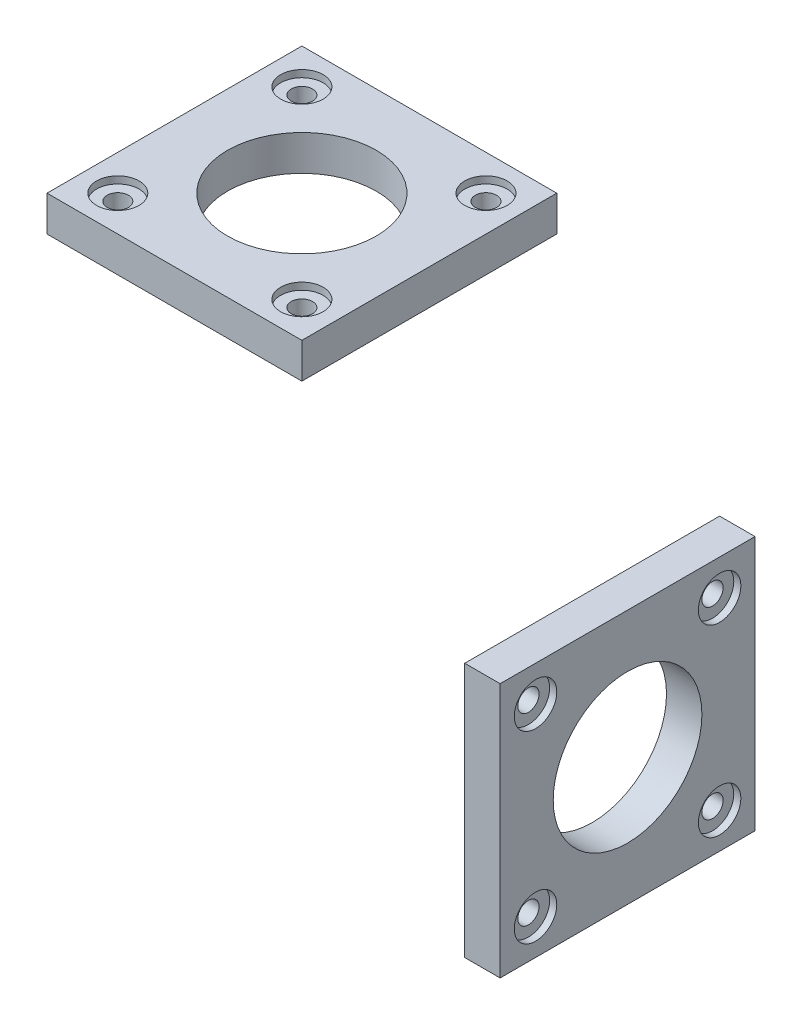
ISO-10303-21;
HEADER;
FILE_DESCRIPTION(('STEP AP214'),'2;1');
FILE_NAME('part.step','',(''),(''),'','','');
FILE_SCHEMA(('AUTOMOTIVE_DESIGN { 1 0 10303 214 1 1 1 1 }'));
ENDSEC;
DATA;
#1=APPLICATION_CONTEXT('core data for automotive mechanical design processes');
#2=APPLICATION_PROTOCOL_DEFINITION('international standard','automotive_design',2000,#1);
#3=PRODUCT_CONTEXT('',#1,'mechanical');
#4=PRODUCT('Part','Part','',(#3));
#5=PRODUCT_RELATED_PRODUCT_CATEGORY('part','',(#4));
#6=PRODUCT_DEFINITION_FORMATION('','',#4);
#7=PRODUCT_DEFINITION_CONTEXT('part definition',#1,'design');
#8=PRODUCT_DEFINITION('design','',#6,#7);
#9=PRODUCT_DEFINITION_SHAPE('','',#8);
#10=(LENGTH_UNIT() NAMED_UNIT(*) SI_UNIT(.MILLI.,.METRE.));
#11=(NAMED_UNIT(*) PLANE_ANGLE_UNIT() SI_UNIT($,.RADIAN.));
#12=(NAMED_UNIT(*) SI_UNIT($,.STERADIAN.) SOLID_ANGLE_UNIT());
#13=UNCERTAINTY_MEASURE_WITH_UNIT(LENGTH_MEASURE(1.E-05),#10,'distance_accuracy_value','');
#14=(GEOMETRIC_REPRESENTATION_CONTEXT(3) GLOBAL_UNCERTAINTY_ASSIGNED_CONTEXT((#13)) GLOBAL_UNIT_ASSIGNED_CONTEXT((#10,
#11,#12)) REPRESENTATION_CONTEXT('',''));
#15=CARTESIAN_POINT('',(0.,0.,0.));
#16=DIRECTION('',(0.,0.,1.));
#17=DIRECTION('',(1.,0.,0.));
#18=AXIS2_PLACEMENT_3D('',#15,#16,#17);
#19=CARTESIAN_POINT('',(460.,0.,-180.));
#20=DIRECTION('',(0.,0.,-1.));
#21=DIRECTION('',(0.,1.,0.));
#22=AXIS2_PLACEMENT_3D('',#19,#20,#21);
#23=PLANE('',#22);
#24=DIRECTION('',(0.,-1.,0.));
#25=VECTOR('',#24,1.);
#26=CARTESIAN_POINT('',(410.,0.,-180.));
#27=LINE('',#26,#25);
#28=CARTESIAN_POINT('',(410.,180.,-180.));
#29=VERTEX_POINT('',#28);
#30=CARTESIAN_POINT('',(410.,-180.,-180.));
#31=VERTEX_POINT('',#30);
#32=EDGE_CURVE('E125',#29,#31,#27,.T.);
#33=ORIENTED_EDGE('',*,*,#32,.F.);
#34=DIRECTION('',(-1.,0.,0.));
#35=VECTOR('',#34,1.);
#36=CARTESIAN_POINT('',(460.,180.,-180.));
#37=LINE('',#36,#35);
#38=CARTESIAN_POINT('',(460.,180.,-180.));
#39=VERTEX_POINT('',#38);
#40=EDGE_CURVE('E93',#39,#29,#37,.T.);
#41=ORIENTED_EDGE('',*,*,#40,.F.);
#42=DIRECTION('',(0.,-1.,0.));
#43=VECTOR('',#42,1.);
#44=CARTESIAN_POINT('',(460.,0.,-180.));
#45=LINE('',#44,#43);
#46=CARTESIAN_POINT('',(460.,-180.,-180.));
#47=VERTEX_POINT('',#46);
#48=EDGE_CURVE('E115',#39,#47,#45,.T.);
#49=ORIENTED_EDGE('',*,*,#48,.T.);
#50=DIRECTION('',(-1.,0.,0.));
#51=VECTOR('',#50,1.);
#52=CARTESIAN_POINT('',(460.,-180.,-180.));
#53=LINE('',#52,#51);
#54=EDGE_CURVE('E90',#47,#31,#53,.T.);
#55=ORIENTED_EDGE('',*,*,#54,.T.);
#56=EDGE_LOOP('',(#33,#41,#49,#55));
#57=FACE_BOUND('',#56,.T.);
#58=ADVANCED_FACE('F49',(#57),#23,.T.);
#59=CARTESIAN_POINT('',(460.,180.,0.));
#60=DIRECTION('',(0.,1.,0.));
#61=DIRECTION('',(0.,0.,1.));
#62=AXIS2_PLACEMENT_3D('',#59,#60,#61);
#63=PLANE('',#62);
#64=DIRECTION('',(0.,0.,-1.));
#65=VECTOR('',#64,1.);
#66=CARTESIAN_POINT('',(410.,180.,0.));
#67=LINE('',#66,#65);
#68=CARTESIAN_POINT('',(410.,180.,180.));
#69=VERTEX_POINT('',#68);
#70=EDGE_CURVE('E104',#69,#29,#67,.T.);
#71=ORIENTED_EDGE('',*,*,#70,.F.);
#72=DIRECTION('',(-1.,0.,0.));
#73=VECTOR('',#72,1.);
#74=CARTESIAN_POINT('',(460.,180.,180.));
#75=LINE('',#74,#73);
#76=CARTESIAN_POINT('',(460.,180.,180.));
#77=VERTEX_POINT('',#76);
#78=EDGE_CURVE('E98',#77,#69,#75,.T.);
#79=ORIENTED_EDGE('',*,*,#78,.F.);
#80=DIRECTION('',(0.,0.,-1.));
#81=VECTOR('',#80,1.);
#82=CARTESIAN_POINT('',(460.,180.,0.));
#83=LINE('',#82,#81);
#84=EDGE_CURVE('E102',#77,#39,#83,.T.);
#85=ORIENTED_EDGE('',*,*,#84,.T.);
#86=ORIENTED_EDGE('',*,*,#40,.T.);
#87=EDGE_LOOP('',(#71,#79,#85,#86));
#88=FACE_BOUND('',#87,.T.);
#89=ADVANCED_FACE('F100',(#88),#63,.T.);
#90=CARTESIAN_POINT('',(460.,0.,180.));
#91=DIRECTION('',(0.,0.,-1.));
#92=DIRECTION('',(0.,1.,0.));
#93=AXIS2_PLACEMENT_3D('',#90,#91,#92);
#94=PLANE('',#93);
#95=DIRECTION('',(0.,-1.,0.));
#96=VECTOR('',#95,1.);
#97=CARTESIAN_POINT('',(410.,0.,180.));
#98=LINE('',#97,#96);
#99=CARTESIAN_POINT('',(410.,-180.,180.));
#100=VERTEX_POINT('',#99);
#101=EDGE_CURVE('E129',#69,#100,#98,.T.);
#102=ORIENTED_EDGE('',*,*,#101,.T.);
#103=DIRECTION('',(-1.,0.,0.));
#104=VECTOR('',#103,1.);
#105=CARTESIAN_POINT('',(460.,-180.,180.));
#106=LINE('',#105,#104);
#107=CARTESIAN_POINT('',(460.,-180.,180.));
#108=VERTEX_POINT('',#107);
#109=EDGE_CURVE('E107',#108,#100,#106,.T.);
#110=ORIENTED_EDGE('',*,*,#109,.F.);
#111=DIRECTION('',(0.,-1.,0.));
#112=VECTOR('',#111,1.);
#113=CARTESIAN_POINT('',(460.,0.,180.));
#114=LINE('',#113,#112);
#115=EDGE_CURVE('E110',#77,#108,#114,.T.);
#116=ORIENTED_EDGE('',*,*,#115,.F.);
#117=ORIENTED_EDGE('',*,*,#78,.T.);
#118=EDGE_LOOP('',(#102,#110,#116,#117));
#119=FACE_BOUND('',#118,.T.);
#120=ADVANCED_FACE('F111',(#119),#94,.F.);
#121=CARTESIAN_POINT('',(460.,-180.,0.));
#122=DIRECTION('',(0.,1.,0.));
#123=DIRECTION('',(0.,0.,1.));
#124=AXIS2_PLACEMENT_3D('',#121,#122,#123);
#125=PLANE('',#124);
#126=DIRECTION('',(0.,0.,-1.));
#127=VECTOR('',#126,1.);
#128=CARTESIAN_POINT('',(410.,-180.,0.));
#129=LINE('',#128,#127);
#130=EDGE_CURVE('E83',#100,#31,#129,.T.);
#131=ORIENTED_EDGE('',*,*,#130,.T.);
#132=ORIENTED_EDGE('',*,*,#54,.F.);
#133=DIRECTION('',(0.,0.,-1.));
#134=VECTOR('',#133,1.);
#135=CARTESIAN_POINT('',(460.,-180.,0.));
#136=LINE('',#135,#134);
#137=EDGE_CURVE('E66',#108,#47,#136,.T.);
#138=ORIENTED_EDGE('',*,*,#137,.F.);
#139=ORIENTED_EDGE('',*,*,#109,.T.);
#140=EDGE_LOOP('',(#131,#132,#138,#139));
#141=FACE_BOUND('',#140,.T.);
#142=ADVANCED_FACE('F195',(#141),#125,.F.);
#143=CARTESIAN_POINT('',(460.,130.,-130.));
#144=DIRECTION('',(-1.,0.,0.));
#145=DIRECTION('',(0.,0.,1.));
#146=AXIS2_PLACEMENT_3D('',#143,#144,#145);
#147=CYLINDRICAL_SURFACE('',#146,30.);
#148=CARTESIAN_POINT('',(450.,130.,-130.));
#149=DIRECTION('',(1.,0.,0.));
#150=DIRECTION('',(0.,0.,-1.));
#151=AXIS2_PLACEMENT_3D('',#148,#149,#150);
#152=CIRCLE('',#151,30.);
#153=CARTESIAN_POINT('',(450.,130.,-160.));
#154=VERTEX_POINT('',#153);
#155=EDGE_CURVE('E12',#154,#154,#152,.T.);
#156=ORIENTED_EDGE('',*,*,#155,.F.);
#157=EDGE_LOOP('',(#156));
#158=FACE_BOUND('',#157,.T.);
#159=CARTESIAN_POINT('',(460.,130.,-130.));
#160=DIRECTION('',(1.,0.,0.));
#161=DIRECTION('',(0.,0.,-1.));
#162=AXIS2_PLACEMENT_3D('',#159,#160,#161);
#163=CIRCLE('',#162,30.);
#164=CARTESIAN_POINT('',(460.,130.,-160.));
#165=VERTEX_POINT('',#164);
#166=EDGE_CURVE('E117',#165,#165,#163,.T.);
#167=ORIENTED_EDGE('',*,*,#166,.T.);
#168=EDGE_LOOP('',(#167));
#169=FACE_BOUND('',#168,.T.);
#170=ADVANCED_FACE('F169',(#158,#169),#147,.F.);
#171=CARTESIAN_POINT('',(460.,-130.,-130.));
#172=DIRECTION('',(-1.,0.,0.));
#173=DIRECTION('',(0.,0.,1.));
#174=AXIS2_PLACEMENT_3D('',#171,#172,#173);
#175=CYLINDRICAL_SURFACE('',#174,29.9999999999999);
#176=CARTESIAN_POINT('',(450.,-130.,-130.));
#177=DIRECTION('',(1.,0.,0.));
#178=DIRECTION('',(0.,0.,-1.));
#179=AXIS2_PLACEMENT_3D('',#176,#177,#178);
#180=CIRCLE('',#179,29.9999999999999);
#181=CARTESIAN_POINT('',(450.,-130.,-159.999999999999));
#182=VERTEX_POINT('',#181);
#183=EDGE_CURVE('E139',#182,#182,#180,.T.);
#184=ORIENTED_EDGE('',*,*,#183,.F.);
#185=EDGE_LOOP('',(#184));
#186=FACE_BOUND('',#185,.T.);
#187=CARTESIAN_POINT('',(460.,-130.,-130.));
#188=DIRECTION('',(1.,0.,0.));
#189=DIRECTION('',(0.,0.,-1.));
#190=AXIS2_PLACEMENT_3D('',#187,#188,#189);
#191=CIRCLE('',#190,29.9999999999999);
#192=CARTESIAN_POINT('',(460.,-130.,-159.999999999999));
#193=VERTEX_POINT('',#192);
#194=EDGE_CURVE('E159',#193,#193,#191,.T.);
#195=ORIENTED_EDGE('',*,*,#194,.T.);
#196=EDGE_LOOP('',(#195));
#197=FACE_BOUND('',#196,.T.);
#198=ADVANCED_FACE('F194',(#186,#197),#175,.F.);
#199=CARTESIAN_POINT('',(460.,-129.999999999998,130.000000000001));
#200=DIRECTION('',(-1.,0.,0.));
#201=DIRECTION('',(0.,0.,1.));
#202=AXIS2_PLACEMENT_3D('',#199,#200,#201);
#203=CYLINDRICAL_SURFACE('',#202,30.0000000000002);
#204=CARTESIAN_POINT('',(450.,-129.999999999998,130.000000000001));
#205=DIRECTION('',(1.,0.,0.));
#206=DIRECTION('',(0.,0.,-1.));
#207=AXIS2_PLACEMENT_3D('',#204,#205,#206);
#208=CIRCLE('',#207,30.0000000000002);
#209=CARTESIAN_POINT('',(450.,-129.999999999998,100.000000000001));
#210=VERTEX_POINT('',#209);
#211=EDGE_CURVE('E142',#210,#210,#208,.T.);
#212=ORIENTED_EDGE('',*,*,#211,.F.);
#213=EDGE_LOOP('',(#212));
#214=FACE_BOUND('',#213,.T.);
#215=CARTESIAN_POINT('',(460.,-129.999999999998,130.000000000001));
#216=DIRECTION('',(1.,0.,0.));
#217=DIRECTION('',(0.,0.,-1.));
#218=AXIS2_PLACEMENT_3D('',#215,#216,#217);
#219=CIRCLE('',#218,30.0000000000002);
#220=CARTESIAN_POINT('',(460.,-129.999999999998,100.000000000001));
#221=VERTEX_POINT('',#220);
#222=EDGE_CURVE('E156',#221,#221,#219,.T.);
#223=ORIENTED_EDGE('',*,*,#222,.T.);
#224=EDGE_LOOP('',(#223));
#225=FACE_BOUND('',#224,.T.);
#226=ADVANCED_FACE('F152',(#214,#225),#203,.F.);
#227=CARTESIAN_POINT('',(460.,130.000000000002,129.999999999999));
#228=DIRECTION('',(-1.,0.,0.));
#229=DIRECTION('',(0.,0.,1.));
#230=AXIS2_PLACEMENT_3D('',#227,#228,#229);
#231=CYLINDRICAL_SURFACE('',#230,29.999999999999);
#232=CARTESIAN_POINT('',(450.,130.000000000002,129.999999999999));
#233=DIRECTION('',(1.,0.,0.));
#234=DIRECTION('',(0.,0.,-1.));
#235=AXIS2_PLACEMENT_3D('',#232,#233,#234);
#236=CIRCLE('',#235,29.999999999999);
#237=CARTESIAN_POINT('',(450.,130.000000000002,99.9999999999998));
#238=VERTEX_POINT('',#237);
#239=EDGE_CURVE('E58',#238,#238,#236,.T.);
#240=ORIENTED_EDGE('',*,*,#239,.F.);
#241=EDGE_LOOP('',(#240));
#242=FACE_BOUND('',#241,.T.);
#243=CARTESIAN_POINT('',(460.,130.000000000002,129.999999999999));
#244=DIRECTION('',(1.,0.,0.));
#245=DIRECTION('',(0.,0.,-1.));
#246=AXIS2_PLACEMENT_3D('',#243,#244,#245);
#247=CIRCLE('',#246,29.999999999999);
#248=CARTESIAN_POINT('',(460.,130.000000000002,99.9999999999998));
#249=VERTEX_POINT('',#248);
#250=EDGE_CURVE('E135',#249,#249,#247,.T.);
#251=ORIENTED_EDGE('',*,*,#250,.T.);
#252=EDGE_LOOP('',(#251));
#253=FACE_BOUND('',#252,.T.);
#254=ADVANCED_FACE('F51',(#242,#253),#231,.F.);
#255=CARTESIAN_POINT('',(460.,0.,0.));
#256=DIRECTION('',(-1.,0.,0.));
#257=DIRECTION('',(0.,0.,1.));
#258=AXIS2_PLACEMENT_3D('',#255,#256,#257);
#259=CYLINDRICAL_SURFACE('',#258,105.);
#260=CARTESIAN_POINT('',(460.,0.,0.));
#261=DIRECTION('',(1.,0.,0.));
#262=DIRECTION('',(0.,0.,-1.));
#263=AXIS2_PLACEMENT_3D('',#260,#261,#262);
#264=CIRCLE('',#263,105.);
#265=CARTESIAN_POINT('',(460.,0.,-105.));
#266=VERTEX_POINT('',#265);
#267=EDGE_CURVE('E122',#266,#266,#264,.T.);
#268=ORIENTED_EDGE('',*,*,#267,.T.);
#269=EDGE_LOOP('',(#268));
#270=FACE_BOUND('',#269,.T.);
#271=CARTESIAN_POINT('',(410.,0.,0.));
#272=DIRECTION('',(1.,0.,0.));
#273=DIRECTION('',(0.,0.,-1.));
#274=AXIS2_PLACEMENT_3D('',#271,#272,#273);
#275=CIRCLE('',#274,105.);
#276=CARTESIAN_POINT('',(410.,0.,-105.));
#277=VERTEX_POINT('',#276);
#278=EDGE_CURVE('E132',#277,#277,#275,.T.);
#279=ORIENTED_EDGE('',*,*,#278,.F.);
#280=EDGE_LOOP('',(#279));
#281=FACE_BOUND('',#280,.T.);
#282=ADVANCED_FACE('F151',(#270,#281),#259,.F.);
#283=CARTESIAN_POINT('',(460.,0.,0.));
#284=DIRECTION('',(1.,0.,0.));
#285=DIRECTION('',(0.,0.,-1.));
#286=AXIS2_PLACEMENT_3D('',#283,#284,#285);
#287=PLANE('',#286);
#288=ORIENTED_EDGE('',*,*,#250,.F.);
#289=EDGE_LOOP('',(#288));
#290=FACE_BOUND('',#289,.T.);
#291=ORIENTED_EDGE('',*,*,#222,.F.);
#292=EDGE_LOOP('',(#291));
#293=FACE_BOUND('',#292,.T.);
#294=ORIENTED_EDGE('',*,*,#194,.F.);
#295=EDGE_LOOP('',(#294));
#296=FACE_BOUND('',#295,.T.);
#297=ORIENTED_EDGE('',*,*,#166,.F.);
#298=EDGE_LOOP('',(#297));
#299=FACE_BOUND('',#298,.T.);
#300=ORIENTED_EDGE('',*,*,#48,.F.);
#301=ORIENTED_EDGE('',*,*,#84,.F.);
#302=ORIENTED_EDGE('',*,*,#115,.T.);
#303=ORIENTED_EDGE('',*,*,#137,.T.);
#304=EDGE_LOOP('',(#300,#301,#302,#303));
#305=FACE_BOUND('',#304,.T.);
#306=ORIENTED_EDGE('',*,*,#267,.F.);
#307=EDGE_LOOP('',(#306));
#308=FACE_BOUND('',#307,.T.);
#309=ADVANCED_FACE('F113',(#290,#293,#296,#299,#305,#308),#287,.T.);
#310=CARTESIAN_POINT('',(410.,0.,0.));
#311=DIRECTION('',(1.,0.,0.));
#312=DIRECTION('',(0.,0.,-1.));
#313=AXIS2_PLACEMENT_3D('',#310,#311,#312);
#314=PLANE('',#313);
#315=ORIENTED_EDGE('',*,*,#32,.T.);
#316=ORIENTED_EDGE('',*,*,#130,.F.);
#317=ORIENTED_EDGE('',*,*,#101,.F.);
#318=ORIENTED_EDGE('',*,*,#70,.T.);
#319=EDGE_LOOP('',(#315,#316,#317,#318));
#320=FACE_BOUND('',#319,.T.);
#321=ORIENTED_EDGE('',*,*,#278,.T.);
#322=EDGE_LOOP('',(#321));
#323=FACE_BOUND('',#322,.T.);
#324=CARTESIAN_POINT('',(410.,-130.,-130.));
#325=DIRECTION('',(1.,0.,0.));
#326=DIRECTION('',(0.,0.,-1.));
#327=AXIS2_PLACEMENT_3D('',#324,#325,#326);
#328=CIRCLE('',#327,14.9999999999999);
#329=CARTESIAN_POINT('',(410.,-130.,-144.999999999999));
#330=VERTEX_POINT('',#329);
#331=EDGE_CURVE('E162',#330,#330,#328,.T.);
#332=ORIENTED_EDGE('',*,*,#331,.T.);
#333=EDGE_LOOP('',(#332));
#334=FACE_BOUND('',#333,.T.);
#335=CARTESIAN_POINT('',(410.,-129.999999999998,130.000000000001));
#336=DIRECTION('',(1.,0.,0.));
#337=DIRECTION('',(0.,0.,-1.));
#338=AXIS2_PLACEMENT_3D('',#335,#336,#337);
#339=CIRCLE('',#338,15.0000000000002);
#340=CARTESIAN_POINT('',(410.,-129.999999999998,115.000000000001));
#341=VERTEX_POINT('',#340);
#342=EDGE_CURVE('E242',#341,#341,#339,.T.);
#343=ORIENTED_EDGE('',*,*,#342,.T.);
#344=EDGE_LOOP('',(#343));
#345=FACE_BOUND('',#344,.T.);
#346=CARTESIAN_POINT('',(410.,130.000000000002,129.999999999999));
#347=DIRECTION('',(1.,0.,0.));
#348=DIRECTION('',(0.,0.,-1.));
#349=AXIS2_PLACEMENT_3D('',#346,#347,#348);
#350=CIRCLE('',#349,14.999999999999);
#351=CARTESIAN_POINT('',(410.,130.000000000002,115.));
#352=VERTEX_POINT('',#351);
#353=EDGE_CURVE('E248',#352,#352,#350,.T.);
#354=ORIENTED_EDGE('',*,*,#353,.T.);
#355=EDGE_LOOP('',(#354));
#356=FACE_BOUND('',#355,.T.);
#357=CARTESIAN_POINT('',(410.,130.,-130.));
#358=DIRECTION('',(1.,0.,0.));
#359=DIRECTION('',(0.,0.,-1.));
#360=AXIS2_PLACEMENT_3D('',#357,#358,#359);
#361=CIRCLE('',#360,15.);
#362=CARTESIAN_POINT('',(410.,130.,-145.));
#363=VERTEX_POINT('',#362);
#364=EDGE_CURVE('E254',#363,#363,#361,.T.);
#365=ORIENTED_EDGE('',*,*,#364,.T.);
#366=EDGE_LOOP('',(#365));
#367=FACE_BOUND('',#366,.T.);
#368=ADVANCED_FACE('F172',(#320,#323,#334,#345,#356,#367),#314,.F.);
#369=CARTESIAN_POINT('',(450.,-130.,-130.));
#370=DIRECTION('',(-1.,0.,0.));
#371=DIRECTION('',(0.,0.,1.));
#372=AXIS2_PLACEMENT_3D('',#369,#370,#371);
#373=CYLINDRICAL_SURFACE('',#372,14.9999999999999);
#374=CARTESIAN_POINT('',(450.,-130.,-130.));
#375=DIRECTION('',(1.,0.,0.));
#376=DIRECTION('',(0.,0.,-1.));
#377=AXIS2_PLACEMENT_3D('',#374,#375,#376);
#378=CIRCLE('',#377,14.9999999999999);
#379=CARTESIAN_POINT('',(450.,-130.,-144.999999999999));
#380=VERTEX_POINT('',#379);
#381=EDGE_CURVE('E127',#380,#380,#378,.T.);
#382=ORIENTED_EDGE('',*,*,#381,.T.);
#383=EDGE_LOOP('',(#382));
#384=FACE_BOUND('',#383,.T.);
#385=ORIENTED_EDGE('',*,*,#331,.F.);
#386=EDGE_LOOP('',(#385));
#387=FACE_BOUND('',#386,.T.);
#388=ADVANCED_FACE('F178',(#384,#387),#373,.F.);
#389=CARTESIAN_POINT('',(450.,0.,0.));
#390=DIRECTION('',(1.,0.,0.));
#391=DIRECTION('',(0.,0.,-1.));
#392=AXIS2_PLACEMENT_3D('',#389,#390,#391);
#393=PLANE('',#392);
#394=ORIENTED_EDGE('',*,*,#381,.F.);
#395=EDGE_LOOP('',(#394));
#396=FACE_BOUND('',#395,.T.);
#397=ORIENTED_EDGE('',*,*,#183,.T.);
#398=EDGE_LOOP('',(#397));
#399=FACE_BOUND('',#398,.T.);
#400=ADVANCED_FACE('F222',(#396,#399),#393,.T.);
#401=CARTESIAN_POINT('',(450.,-129.999999999998,130.000000000001));
#402=DIRECTION('',(-1.,0.,0.));
#403=DIRECTION('',(0.,0.,1.));
#404=AXIS2_PLACEMENT_3D('',#401,#402,#403);
#405=CYLINDRICAL_SURFACE('',#404,15.0000000000002);
#406=CARTESIAN_POINT('',(450.,-129.999999999998,130.000000000001));
#407=DIRECTION('',(1.,0.,0.));
#408=DIRECTION('',(0.,0.,-1.));
#409=AXIS2_PLACEMENT_3D('',#406,#407,#408);
#410=CIRCLE('',#409,15.0000000000002);
#411=CARTESIAN_POINT('',(450.,-129.999999999998,115.000000000001));
#412=VERTEX_POINT('',#411);
#413=EDGE_CURVE('E240',#412,#412,#410,.T.);
#414=ORIENTED_EDGE('',*,*,#413,.T.);
#415=EDGE_LOOP('',(#414));
#416=FACE_BOUND('',#415,.T.);
#417=ORIENTED_EDGE('',*,*,#342,.F.);
#418=EDGE_LOOP('',(#417));
#419=FACE_BOUND('',#418,.T.);
#420=ADVANCED_FACE('F213',(#416,#419),#405,.F.);
#421=CARTESIAN_POINT('',(450.,0.,0.));
#422=DIRECTION('',(1.,0.,0.));
#423=DIRECTION('',(0.,0.,-1.));
#424=AXIS2_PLACEMENT_3D('',#421,#422,#423);
#425=PLANE('',#424);
#426=ORIENTED_EDGE('',*,*,#413,.F.);
#427=EDGE_LOOP('',(#426));
#428=FACE_BOUND('',#427,.T.);
#429=ORIENTED_EDGE('',*,*,#211,.T.);
#430=EDGE_LOOP('',(#429));
#431=FACE_BOUND('',#430,.T.);
#432=ADVANCED_FACE('F210',(#428,#431),#425,.T.);
#433=CARTESIAN_POINT('',(450.,130.000000000002,129.999999999999));
#434=DIRECTION('',(-1.,0.,0.));
#435=DIRECTION('',(0.,0.,1.));
#436=AXIS2_PLACEMENT_3D('',#433,#434,#435);
#437=CYLINDRICAL_SURFACE('',#436,14.999999999999);
#438=CARTESIAN_POINT('',(450.,130.000000000002,129.999999999999));
#439=DIRECTION('',(1.,0.,0.));
#440=DIRECTION('',(0.,0.,-1.));
#441=AXIS2_PLACEMENT_3D('',#438,#439,#440);
#442=CIRCLE('',#441,14.999999999999);
#443=CARTESIAN_POINT('',(450.,130.000000000002,115.));
#444=VERTEX_POINT('',#443);
#445=EDGE_CURVE('E245',#444,#444,#442,.T.);
#446=ORIENTED_EDGE('',*,*,#445,.T.);
#447=EDGE_LOOP('',(#446));
#448=FACE_BOUND('',#447,.T.);
#449=ORIENTED_EDGE('',*,*,#353,.F.);
#450=EDGE_LOOP('',(#449));
#451=FACE_BOUND('',#450,.T.);
#452=ADVANCED_FACE('F212',(#448,#451),#437,.F.);
#453=CARTESIAN_POINT('',(450.,0.,0.));
#454=DIRECTION('',(1.,0.,0.));
#455=DIRECTION('',(0.,0.,-1.));
#456=AXIS2_PLACEMENT_3D('',#453,#454,#455);
#457=PLANE('',#456);
#458=ORIENTED_EDGE('',*,*,#445,.F.);
#459=EDGE_LOOP('',(#458));
#460=FACE_BOUND('',#459,.T.);
#461=ORIENTED_EDGE('',*,*,#239,.T.);
#462=EDGE_LOOP('',(#461));
#463=FACE_BOUND('',#462,.T.);
#464=ADVANCED_FACE('F147',(#460,#463),#457,.T.);
#465=CARTESIAN_POINT('',(450.,130.,-130.));
#466=DIRECTION('',(-1.,0.,0.));
#467=DIRECTION('',(0.,0.,1.));
#468=AXIS2_PLACEMENT_3D('',#465,#466,#467);
#469=CYLINDRICAL_SURFACE('',#468,15.);
#470=CARTESIAN_POINT('',(450.,130.,-130.));
#471=DIRECTION('',(1.,0.,0.));
#472=DIRECTION('',(0.,0.,-1.));
#473=AXIS2_PLACEMENT_3D('',#470,#471,#472);
#474=CIRCLE('',#473,15.);
#475=CARTESIAN_POINT('',(450.,130.,-145.));
#476=VERTEX_POINT('',#475);
#477=EDGE_CURVE('E251',#476,#476,#474,.T.);
#478=ORIENTED_EDGE('',*,*,#477,.T.);
#479=EDGE_LOOP('',(#478));
#480=FACE_BOUND('',#479,.T.);
#481=ORIENTED_EDGE('',*,*,#364,.F.);
#482=EDGE_LOOP('',(#481));
#483=FACE_BOUND('',#482,.T.);
#484=ADVANCED_FACE('F260',(#480,#483),#469,.F.);
#485=CARTESIAN_POINT('',(450.,0.,0.));
#486=DIRECTION('',(1.,0.,0.));
#487=DIRECTION('',(0.,0.,-1.));
#488=AXIS2_PLACEMENT_3D('',#485,#486,#487);
#489=PLANE('',#488);
#490=ORIENTED_EDGE('',*,*,#477,.F.);
#491=EDGE_LOOP('',(#490));
#492=FACE_BOUND('',#491,.T.);
#493=ORIENTED_EDGE('',*,*,#155,.T.);
#494=EDGE_LOOP('',(#493));
#495=FACE_BOUND('',#494,.T.);
#496=ADVANCED_FACE('F263',(#492,#495),#489,.T.);
#497=CLOSED_SHELL('',(#58,#89,#120,#142,#170,#198,#226,#254,#282,#309,#368,#388,#400,#420,#432,
#452,#464,#484,#496));
#498=MANIFOLD_SOLID_BREP('B2',#497);
#499=CARTESIAN_POINT('',(0.,460.,-180.));
#500=DIRECTION('',(0.,0.,-1.));
#501=DIRECTION('',(-1.,0.,0.));
#502=AXIS2_PLACEMENT_3D('',#499,#500,#501);
#503=PLANE('',#502);
#504=DIRECTION('',(1.,0.,0.));
#505=VECTOR('',#504,1.);
#506=CARTESIAN_POINT('',(0.,410.,-180.));
#507=LINE('',#506,#505);
#508=CARTESIAN_POINT('',(-180.,410.,-180.));
#509=VERTEX_POINT('',#508);
#510=CARTESIAN_POINT('',(180.,410.,-180.));
#511=VERTEX_POINT('',#510);
#512=EDGE_CURVE('E522',#509,#511,#507,.T.);
#513=ORIENTED_EDGE('',*,*,#512,.F.);
#514=DIRECTION('',(0.,-1.,0.));
#515=VECTOR('',#514,1.);
#516=CARTESIAN_POINT('',(-180.,460.,-180.));
#517=LINE('',#516,#515);
#518=CARTESIAN_POINT('',(-180.,460.,-180.));
#519=VERTEX_POINT('',#518);
#520=EDGE_CURVE('E456',#519,#509,#517,.T.);
#521=ORIENTED_EDGE('',*,*,#520,.F.);
#522=DIRECTION('',(1.,0.,0.));
#523=VECTOR('',#522,1.);
#524=CARTESIAN_POINT('',(0.,460.,-180.));
#525=LINE('',#524,#523);
#526=CARTESIAN_POINT('',(180.,460.,-180.));
#527=VERTEX_POINT('',#526);
#528=EDGE_CURVE('E475',#519,#527,#525,.T.);
#529=ORIENTED_EDGE('',*,*,#528,.T.);
#530=DIRECTION('',(0.,-1.,0.));
#531=VECTOR('',#530,1.);
#532=CARTESIAN_POINT('',(180.,460.,-180.));
#533=LINE('',#532,#531);
#534=EDGE_CURVE('E433',#527,#511,#533,.T.);
#535=ORIENTED_EDGE('',*,*,#534,.T.);
#536=EDGE_LOOP('',(#513,#521,#529,#535));
#537=FACE_BOUND('',#536,.T.);
#538=ADVANCED_FACE('F416',(#537),#503,.T.);
#539=CARTESIAN_POINT('',(-180.,460.,0.));
#540=DIRECTION('',(1.,0.,0.));
#541=DIRECTION('',(0.,0.,-1.));
#542=AXIS2_PLACEMENT_3D('',#539,#540,#541);
#543=PLANE('',#542);
#544=DIRECTION('',(0.,0.,1.));
#545=VECTOR('',#544,1.);
#546=CARTESIAN_POINT('',(-180.,410.,0.));
#547=LINE('',#546,#545);
#548=CARTESIAN_POINT('',(-180.,410.,180.));
#549=VERTEX_POINT('',#548);
#550=EDGE_CURVE('E480',#509,#549,#547,.T.);
#551=ORIENTED_EDGE('',*,*,#550,.T.);
#552=DIRECTION('',(0.,-1.,0.));
#553=VECTOR('',#552,1.);
#554=CARTESIAN_POINT('',(-180.,460.,180.));
#555=LINE('',#554,#553);
#556=CARTESIAN_POINT('',(-180.,460.,180.));
#557=VERTEX_POINT('',#556);
#558=EDGE_CURVE('E465',#557,#549,#555,.T.);
#559=ORIENTED_EDGE('',*,*,#558,.F.);
#560=DIRECTION('',(0.,0.,1.));
#561=VECTOR('',#560,1.);
#562=CARTESIAN_POINT('',(-180.,460.,0.));
#563=LINE('',#562,#561);
#564=EDGE_CURVE('E470',#519,#557,#563,.T.);
#565=ORIENTED_EDGE('',*,*,#564,.F.);
#566=ORIENTED_EDGE('',*,*,#520,.T.);
#567=EDGE_LOOP('',(#551,#559,#565,#566));
#568=FACE_BOUND('',#567,.T.);
#569=ADVANCED_FACE('F478',(#568),#543,.F.);
#570=CARTESIAN_POINT('',(0.,460.,180.));
#571=DIRECTION('',(0.,0.,-1.));
#572=DIRECTION('',(-1.,0.,0.));
#573=AXIS2_PLACEMENT_3D('',#570,#571,#572);
#574=PLANE('',#573);
#575=DIRECTION('',(1.,0.,0.));
#576=VECTOR('',#575,1.);
#577=CARTESIAN_POINT('',(0.,410.,180.));
#578=LINE('',#577,#576);
#579=CARTESIAN_POINT('',(180.,410.,180.));
#580=VERTEX_POINT('',#579);
#581=EDGE_CURVE('E526',#549,#580,#578,.T.);
#582=ORIENTED_EDGE('',*,*,#581,.T.);
#583=DIRECTION('',(0.,-1.,0.));
#584=VECTOR('',#583,1.);
#585=CARTESIAN_POINT('',(180.,460.,180.));
#586=LINE('',#585,#584);
#587=CARTESIAN_POINT('',(180.,460.,180.));
#588=VERTEX_POINT('',#587);
#589=EDGE_CURVE('E448',#588,#580,#586,.T.);
#590=ORIENTED_EDGE('',*,*,#589,.F.);
#591=DIRECTION('',(1.,0.,0.));
#592=VECTOR('',#591,1.);
#593=CARTESIAN_POINT('',(0.,460.,180.));
#594=LINE('',#593,#592);
#595=EDGE_CURVE('E461',#557,#588,#594,.T.);
#596=ORIENTED_EDGE('',*,*,#595,.F.);
#597=ORIENTED_EDGE('',*,*,#558,.T.);
#598=EDGE_LOOP('',(#582,#590,#596,#597));
#599=FACE_BOUND('',#598,.T.);
#600=ADVANCED_FACE('F463',(#599),#574,.F.);
#601=CARTESIAN_POINT('',(180.,460.,0.));
#602=DIRECTION('',(1.,0.,0.));
#603=DIRECTION('',(0.,0.,-1.));
#604=AXIS2_PLACEMENT_3D('',#601,#602,#603);
#605=PLANE('',#604);
#606=DIRECTION('',(0.,0.,1.));
#607=VECTOR('',#606,1.);
#608=CARTESIAN_POINT('',(180.,410.,0.));
#609=LINE('',#608,#607);
#610=EDGE_CURVE('E528',#511,#580,#609,.T.);
#611=ORIENTED_EDGE('',*,*,#610,.F.);
#612=ORIENTED_EDGE('',*,*,#534,.F.);
#613=DIRECTION('',(0.,0.,1.));
#614=VECTOR('',#613,1.);
#615=CARTESIAN_POINT('',(180.,460.,0.));
#616=LINE('',#615,#614);
#617=EDGE_CURVE('E469',#527,#588,#616,.T.);
#618=ORIENTED_EDGE('',*,*,#617,.T.);
#619=ORIENTED_EDGE('',*,*,#589,.T.);
#620=EDGE_LOOP('',(#611,#612,#618,#619));
#621=FACE_BOUND('',#620,.T.);
#622=ADVANCED_FACE('F561',(#621),#605,.T.);
#623=CARTESIAN_POINT('',(130.,460.,-130.));
#624=DIRECTION('',(0.,-1.,0.));
#625=DIRECTION('',(0.,0.,-1.));
#626=AXIS2_PLACEMENT_3D('',#623,#624,#625);
#627=CYLINDRICAL_SURFACE('',#626,30.);
#628=CARTESIAN_POINT('',(130.,450.,-130.));
#629=DIRECTION('',(0.,1.,0.));
#630=DIRECTION('',(0.,0.,1.));
#631=AXIS2_PLACEMENT_3D('',#628,#629,#630);
#632=CIRCLE('',#631,30.);
#633=CARTESIAN_POINT('',(130.,450.,-99.9999999999999));
#634=VERTEX_POINT('',#633);
#635=EDGE_CURVE('E482',#634,#634,#632,.T.);
#636=ORIENTED_EDGE('',*,*,#635,.F.);
#637=EDGE_LOOP('',(#636));
#638=FACE_BOUND('',#637,.T.);
#639=CARTESIAN_POINT('',(130.,460.,-130.));
#640=DIRECTION('',(0.,1.,0.));
#641=DIRECTION('',(0.,0.,1.));
#642=AXIS2_PLACEMENT_3D('',#639,#640,#641);
#643=CIRCLE('',#642,30.);
#644=CARTESIAN_POINT('',(130.,460.,-99.9999999999999));
#645=VERTEX_POINT('',#644);
#646=EDGE_CURVE('E508',#645,#645,#643,.T.);
#647=ORIENTED_EDGE('',*,*,#646,.T.);
#648=EDGE_LOOP('',(#647));
#649=FACE_BOUND('',#648,.T.);
#650=ADVANCED_FACE('F558',(#638,#649),#627,.F.);
#651=CARTESIAN_POINT('',(129.999999999998,460.,130.));
#652=DIRECTION('',(0.,-1.,0.));
#653=DIRECTION('',(0.,0.,-1.));
#654=AXIS2_PLACEMENT_3D('',#651,#652,#653);
#655=CYLINDRICAL_SURFACE('',#654,30.0000000000005);
#656=CARTESIAN_POINT('',(129.999999999998,450.,130.));
#657=DIRECTION('',(0.,1.,0.));
#658=DIRECTION('',(0.,0.,1.));
#659=AXIS2_PLACEMENT_3D('',#656,#657,#658);
#660=CIRCLE('',#659,30.0000000000005);
#661=CARTESIAN_POINT('',(129.999999999998,450.,160.000000000001));
#662=VERTEX_POINT('',#661);
#663=EDGE_CURVE('E47',#662,#662,#660,.T.);
#664=ORIENTED_EDGE('',*,*,#663,.F.);
#665=EDGE_LOOP('',(#664));
#666=FACE_BOUND('',#665,.T.);
#667=CARTESIAN_POINT('',(129.999999999998,460.,130.));
#668=DIRECTION('',(0.,1.,0.));
#669=DIRECTION('',(0.,0.,1.));
#670=AXIS2_PLACEMENT_3D('',#667,#668,#669);
#671=CIRCLE('',#670,30.0000000000005);
#672=CARTESIAN_POINT('',(129.999999999998,460.,160.000000000001));
#673=VERTEX_POINT('',#672);
#674=EDGE_CURVE('E504',#673,#673,#671,.T.);
#675=ORIENTED_EDGE('',*,*,#674,.T.);
#676=EDGE_LOOP('',(#675));
#677=FACE_BOUND('',#676,.T.);
#678=ADVANCED_FACE('F499',(#666,#677),#655,.F.);
#679=CARTESIAN_POINT('',(-130.000000000002,460.,129.999999999998));
#680=DIRECTION('',(0.,-1.,0.));
#681=DIRECTION('',(0.,0.,-1.));
#682=AXIS2_PLACEMENT_3D('',#679,#680,#681);
#683=CYLINDRICAL_SURFACE('',#682,29.9999999999986);
#684=CARTESIAN_POINT('',(-130.000000000002,450.,129.999999999998));
#685=DIRECTION('',(0.,1.,0.));
#686=DIRECTION('',(0.,0.,1.));
#687=AXIS2_PLACEMENT_3D('',#684,#685,#686);
#688=CIRCLE('',#687,29.9999999999986);
#689=CARTESIAN_POINT('',(-130.000000000002,450.,159.999999999997));
#690=VERTEX_POINT('',#689);
#691=EDGE_CURVE('E425',#690,#690,#688,.T.);
#692=ORIENTED_EDGE('',*,*,#691,.F.);
#693=EDGE_LOOP('',(#692));
#694=FACE_BOUND('',#693,.T.);
#695=CARTESIAN_POINT('',(-130.000000000002,460.,129.999999999998));
#696=DIRECTION('',(0.,1.,0.));
#697=DIRECTION('',(0.,0.,1.));
#698=AXIS2_PLACEMENT_3D('',#695,#696,#697);
#699=CIRCLE('',#698,29.9999999999986);
#700=CARTESIAN_POINT('',(-130.000000000002,460.,159.999999999997));
#701=VERTEX_POINT('',#700);
#702=EDGE_CURVE('E502',#701,#701,#699,.T.);
#703=ORIENTED_EDGE('',*,*,#702,.T.);
#704=EDGE_LOOP('',(#703));
#705=FACE_BOUND('',#704,.T.);
#706=ADVANCED_FACE('F496',(#694,#705),#683,.F.);
#707=CARTESIAN_POINT('',(-130.,460.,-130.000000000002));
#708=DIRECTION('',(0.,-1.,0.));
#709=DIRECTION('',(0.,0.,-1.));
#710=AXIS2_PLACEMENT_3D('',#707,#708,#709);
#711=CYLINDRICAL_SURFACE('',#710,29.9999999999986);
#712=CARTESIAN_POINT('',(-130.,450.,-130.000000000002));
#713=DIRECTION('',(0.,1.,0.));
#714=DIRECTION('',(0.,0.,1.));
#715=AXIS2_PLACEMENT_3D('',#712,#713,#714);
#716=CIRCLE('',#715,29.9999999999986);
#717=CARTESIAN_POINT('',(-130.,450.,-100.000000000003));
#718=VERTEX_POINT('',#717);
#719=EDGE_CURVE('E489',#718,#718,#716,.T.);
#720=ORIENTED_EDGE('',*,*,#719,.F.);
#721=EDGE_LOOP('',(#720));
#722=FACE_BOUND('',#721,.T.);
#723=CARTESIAN_POINT('',(-130.,460.,-130.000000000002));
#724=DIRECTION('',(0.,1.,0.));
#725=DIRECTION('',(0.,0.,1.));
#726=AXIS2_PLACEMENT_3D('',#723,#724,#725);
#727=CIRCLE('',#726,29.9999999999986);
#728=CARTESIAN_POINT('',(-130.,460.,-100.000000000003));
#729=VERTEX_POINT('',#728);
#730=EDGE_CURVE('E505',#729,#729,#727,.T.);
#731=ORIENTED_EDGE('',*,*,#730,.T.);
#732=EDGE_LOOP('',(#731));
#733=FACE_BOUND('',#732,.T.);
#734=ADVANCED_FACE('F418',(#722,#733),#711,.F.);
#735=CARTESIAN_POINT('',(0.,460.,0.));
#736=DIRECTION('',(0.,-1.,0.));
#737=DIRECTION('',(0.,0.,-1.));
#738=AXIS2_PLACEMENT_3D('',#735,#736,#737);
#739=CYLINDRICAL_SURFACE('',#738,105.);
#740=CARTESIAN_POINT('',(0.,460.,0.));
#741=DIRECTION('',(0.,1.,0.));
#742=DIRECTION('',(0.,0.,1.));
#743=AXIS2_PLACEMENT_3D('',#740,#741,#742);
#744=CIRCLE('',#743,105.);
#745=CARTESIAN_POINT('',(0.,460.,105.));
#746=VERTEX_POINT('',#745);
#747=EDGE_CURVE('E519',#746,#746,#744,.T.);
#748=ORIENTED_EDGE('',*,*,#747,.T.);
#749=EDGE_LOOP('',(#748));
#750=FACE_BOUND('',#749,.T.);
#751=CARTESIAN_POINT('',(0.,410.,0.));
#752=DIRECTION('',(0.,1.,0.));
#753=DIRECTION('',(0.,0.,1.));
#754=AXIS2_PLACEMENT_3D('',#751,#752,#753);
#755=CIRCLE('',#754,105.);
#756=CARTESIAN_POINT('',(0.,410.,105.));
#757=VERTEX_POINT('',#756);
#758=EDGE_CURVE('E511',#757,#757,#755,.T.);
#759=ORIENTED_EDGE('',*,*,#758,.F.);
#760=EDGE_LOOP('',(#759));
#761=FACE_BOUND('',#760,.T.);
#762=ADVANCED_FACE('F537',(#750,#761),#739,.F.);
#763=CARTESIAN_POINT('',(0.,460.,0.));
#764=DIRECTION('',(0.,1.,0.));
#765=DIRECTION('',(0.,0.,1.));
#766=AXIS2_PLACEMENT_3D('',#763,#764,#765);
#767=PLANE('',#766);
#768=ORIENTED_EDGE('',*,*,#730,.F.);
#769=EDGE_LOOP('',(#768));
#770=FACE_BOUND('',#769,.T.);
#771=ORIENTED_EDGE('',*,*,#702,.F.);
#772=EDGE_LOOP('',(#771));
#773=FACE_BOUND('',#772,.T.);
#774=ORIENTED_EDGE('',*,*,#674,.F.);
#775=EDGE_LOOP('',(#774));
#776=FACE_BOUND('',#775,.T.);
#777=ORIENTED_EDGE('',*,*,#646,.F.);
#778=EDGE_LOOP('',(#777));
#779=FACE_BOUND('',#778,.T.);
#780=ORIENTED_EDGE('',*,*,#528,.F.);
#781=ORIENTED_EDGE('',*,*,#564,.T.);
#782=ORIENTED_EDGE('',*,*,#595,.T.);
#783=ORIENTED_EDGE('',*,*,#617,.F.);
#784=EDGE_LOOP('',(#780,#781,#782,#783));
#785=FACE_BOUND('',#784,.T.);
#786=ORIENTED_EDGE('',*,*,#747,.F.);
#787=EDGE_LOOP('',(#786));
#788=FACE_BOUND('',#787,.T.);
#789=ADVANCED_FACE('F473',(#770,#773,#776,#779,#785,#788),#767,.T.);
#790=CARTESIAN_POINT('',(0.,410.,0.));
#791=DIRECTION('',(0.,1.,0.));
#792=DIRECTION('',(0.,0.,1.));
#793=AXIS2_PLACEMENT_3D('',#790,#791,#792);
#794=PLANE('',#793);
#795=ORIENTED_EDGE('',*,*,#512,.T.);
#796=ORIENTED_EDGE('',*,*,#610,.T.);
#797=ORIENTED_EDGE('',*,*,#581,.F.);
#798=ORIENTED_EDGE('',*,*,#550,.F.);
#799=EDGE_LOOP('',(#795,#796,#797,#798));
#800=FACE_BOUND('',#799,.T.);
#801=ORIENTED_EDGE('',*,*,#758,.T.);
#802=EDGE_LOOP('',(#801));
#803=FACE_BOUND('',#802,.T.);
#804=CARTESIAN_POINT('',(130.,410.,-130.));
#805=DIRECTION('',(0.,1.,0.));
#806=DIRECTION('',(0.,0.,1.));
#807=AXIS2_PLACEMENT_3D('',#804,#805,#806);
#808=CIRCLE('',#807,15.);
#809=CARTESIAN_POINT('',(130.,410.,-115.));
#810=VERTEX_POINT('',#809);
#811=EDGE_CURVE('E742',#810,#810,#808,.T.);
#812=ORIENTED_EDGE('',*,*,#811,.T.);
#813=EDGE_LOOP('',(#812));
#814=FACE_BOUND('',#813,.T.);
#815=CARTESIAN_POINT('',(-130.,410.,-130.000000000002));
#816=DIRECTION('',(0.,1.,0.));
#817=DIRECTION('',(0.,0.,1.));
#818=AXIS2_PLACEMENT_3D('',#815,#816,#817);
#819=CIRCLE('',#818,14.9999999999986);
#820=CARTESIAN_POINT('',(-130.,410.,-115.000000000003));
#821=VERTEX_POINT('',#820);
#822=EDGE_CURVE('E746',#821,#821,#819,.T.);
#823=ORIENTED_EDGE('',*,*,#822,.T.);
#824=EDGE_LOOP('',(#823));
#825=FACE_BOUND('',#824,.T.);
#826=CARTESIAN_POINT('',(-130.000000000002,410.,129.999999999998));
#827=DIRECTION('',(0.,1.,0.));
#828=DIRECTION('',(0.,0.,1.));
#829=AXIS2_PLACEMENT_3D('',#826,#827,#828);
#830=CIRCLE('',#829,14.9999999999986);
#831=CARTESIAN_POINT('',(-130.000000000002,410.,144.999999999997));
#832=VERTEX_POINT('',#831);
#833=EDGE_CURVE('E752',#832,#832,#830,.T.);
#834=ORIENTED_EDGE('',*,*,#833,.T.);
#835=EDGE_LOOP('',(#834));
#836=FACE_BOUND('',#835,.T.);
#837=CARTESIAN_POINT('',(129.999999999998,410.,130.));
#838=DIRECTION('',(0.,1.,0.));
#839=DIRECTION('',(0.,0.,1.));
#840=AXIS2_PLACEMENT_3D('',#837,#838,#839);
#841=CIRCLE('',#840,15.0000000000005);
#842=CARTESIAN_POINT('',(129.999999999998,410.,145.000000000001));
#843=VERTEX_POINT('',#842);
#844=EDGE_CURVE('E758',#843,#843,#841,.T.);
#845=ORIENTED_EDGE('',*,*,#844,.T.);
#846=EDGE_LOOP('',(#845));
#847=FACE_BOUND('',#846,.T.);
#848=ADVANCED_FACE('F534',(#800,#803,#814,#825,#836,#847),#794,.F.);
#849=CARTESIAN_POINT('',(130.,450.,-130.));
#850=DIRECTION('',(0.,-1.,0.));
#851=DIRECTION('',(0.,0.,-1.));
#852=AXIS2_PLACEMENT_3D('',#849,#850,#851);
#853=CYLINDRICAL_SURFACE('',#852,15.);
#854=CARTESIAN_POINT('',(130.,450.,-130.));
#855=DIRECTION('',(0.,1.,0.));
#856=DIRECTION('',(0.,0.,1.));
#857=AXIS2_PLACEMENT_3D('',#854,#855,#856);
#858=CIRCLE('',#857,15.);
#859=CARTESIAN_POINT('',(130.,450.,-115.));
#860=VERTEX_POINT('',#859);
#861=EDGE_CURVE('E524',#860,#860,#858,.T.);
#862=ORIENTED_EDGE('',*,*,#861,.T.);
#863=EDGE_LOOP('',(#862));
#864=FACE_BOUND('',#863,.T.);
#865=ORIENTED_EDGE('',*,*,#811,.F.);
#866=EDGE_LOOP('',(#865));
#867=FACE_BOUND('',#866,.T.);
#868=ADVANCED_FACE('F605',(#864,#867),#853,.F.);
#869=CARTESIAN_POINT('',(0.,450.,0.));
#870=DIRECTION('',(0.,1.,0.));
#871=DIRECTION('',(0.,0.,1.));
#872=AXIS2_PLACEMENT_3D('',#869,#870,#871);
#873=PLANE('',#872);
#874=ORIENTED_EDGE('',*,*,#861,.F.);
#875=EDGE_LOOP('',(#874));
#876=FACE_BOUND('',#875,.T.);
#877=ORIENTED_EDGE('',*,*,#635,.T.);
#878=EDGE_LOOP('',(#877));
#879=FACE_BOUND('',#878,.T.);
#880=ADVANCED_FACE('F601',(#876,#879),#873,.T.);
#881=CARTESIAN_POINT('',(-130.,450.,-130.000000000002));
#882=DIRECTION('',(0.,-1.,0.));
#883=DIRECTION('',(0.,0.,-1.));
#884=AXIS2_PLACEMENT_3D('',#881,#882,#883);
#885=CYLINDRICAL_SURFACE('',#884,14.9999999999986);
#886=CARTESIAN_POINT('',(-130.,450.,-130.000000000002));
#887=DIRECTION('',(0.,1.,0.));
#888=DIRECTION('',(0.,0.,1.));
#889=AXIS2_PLACEMENT_3D('',#886,#887,#888);
#890=CIRCLE('',#889,14.9999999999986);
#891=CARTESIAN_POINT('',(-130.,450.,-115.000000000003));
#892=VERTEX_POINT('',#891);
#893=EDGE_CURVE('E743',#892,#892,#890,.T.);
#894=ORIENTED_EDGE('',*,*,#893,.T.);
#895=EDGE_LOOP('',(#894));
#896=FACE_BOUND('',#895,.T.);
#897=ORIENTED_EDGE('',*,*,#822,.F.);
#898=EDGE_LOOP('',(#897));
#899=FACE_BOUND('',#898,.T.);
#900=ADVANCED_FACE('F597',(#896,#899),#885,.F.);
#901=CARTESIAN_POINT('',(0.,450.,0.));
#902=DIRECTION('',(0.,1.,0.));
#903=DIRECTION('',(0.,0.,1.));
#904=AXIS2_PLACEMENT_3D('',#901,#902,#903);
#905=PLANE('',#904);
#906=ORIENTED_EDGE('',*,*,#893,.F.);
#907=EDGE_LOOP('',(#906));
#908=FACE_BOUND('',#907,.T.);
#909=ORIENTED_EDGE('',*,*,#719,.T.);
#910=EDGE_LOOP('',(#909));
#911=FACE_BOUND('',#910,.T.);
#912=ADVANCED_FACE('F593',(#908,#911),#905,.T.);
#913=CARTESIAN_POINT('',(-130.000000000002,450.,129.999999999998));
#914=DIRECTION('',(0.,-1.,0.));
#915=DIRECTION('',(0.,0.,-1.));
#916=AXIS2_PLACEMENT_3D('',#913,#914,#915);
#917=CYLINDRICAL_SURFACE('',#916,14.9999999999986);
#918=CARTESIAN_POINT('',(-130.000000000002,450.,129.999999999998));
#919=DIRECTION('',(0.,1.,0.));
#920=DIRECTION('',(0.,0.,1.));
#921=AXIS2_PLACEMENT_3D('',#918,#919,#920);
#922=CIRCLE('',#921,14.9999999999986);
#923=CARTESIAN_POINT('',(-130.000000000002,450.,144.999999999997));
#924=VERTEX_POINT('',#923);
#925=EDGE_CURVE('E750',#924,#924,#922,.T.);
#926=ORIENTED_EDGE('',*,*,#925,.T.);
#927=EDGE_LOOP('',(#926));
#928=FACE_BOUND('',#927,.T.);
#929=ORIENTED_EDGE('',*,*,#833,.F.);
#930=EDGE_LOOP('',(#929));
#931=FACE_BOUND('',#930,.T.);
#932=ADVANCED_FACE('F589',(#928,#931),#917,.F.);
#933=CARTESIAN_POINT('',(0.,450.,0.));
#934=DIRECTION('',(0.,1.,0.));
#935=DIRECTION('',(0.,0.,1.));
#936=AXIS2_PLACEMENT_3D('',#933,#934,#935);
#937=PLANE('',#936);
#938=ORIENTED_EDGE('',*,*,#925,.F.);
#939=EDGE_LOOP('',(#938));
#940=FACE_BOUND('',#939,.T.);
#941=ORIENTED_EDGE('',*,*,#691,.T.);
#942=EDGE_LOOP('',(#941));
#943=FACE_BOUND('',#942,.T.);
#944=ADVANCED_FACE('F494',(#940,#943),#937,.T.);
#945=CARTESIAN_POINT('',(129.999999999998,450.,130.));
#946=DIRECTION('',(0.,-1.,0.));
#947=DIRECTION('',(0.,0.,-1.));
#948=AXIS2_PLACEMENT_3D('',#945,#946,#947);
#949=CYLINDRICAL_SURFACE('',#948,15.0000000000005);
#950=CARTESIAN_POINT('',(129.999999999998,450.,130.));
#951=DIRECTION('',(0.,1.,0.));
#952=DIRECTION('',(0.,0.,1.));
#953=AXIS2_PLACEMENT_3D('',#950,#951,#952);
#954=CIRCLE('',#953,15.0000000000005);
#955=CARTESIAN_POINT('',(129.999999999998,450.,145.000000000001));
#956=VERTEX_POINT('',#955);
#957=EDGE_CURVE('E755',#956,#956,#954,.T.);
#958=ORIENTED_EDGE('',*,*,#957,.T.);
#959=EDGE_LOOP('',(#958));
#960=FACE_BOUND('',#959,.T.);
#961=ORIENTED_EDGE('',*,*,#844,.F.);
#962=EDGE_LOOP('',(#961));
#963=FACE_BOUND('',#962,.T.);
#964=ADVANCED_FACE('F577',(#960,#963),#949,.F.);
#965=CARTESIAN_POINT('',(0.,450.,0.));
#966=DIRECTION('',(0.,1.,0.));
#967=DIRECTION('',(0.,0.,1.));
#968=AXIS2_PLACEMENT_3D('',#965,#966,#967);
#969=PLANE('',#968);
#970=ORIENTED_EDGE('',*,*,#957,.F.);
#971=EDGE_LOOP('',(#970));
#972=FACE_BOUND('',#971,.T.);
#973=ORIENTED_EDGE('',*,*,#663,.T.);
#974=EDGE_LOOP('',(#973));
#975=FACE_BOUND('',#974,.T.);
#976=ADVANCED_FACE('F575',(#972,#975),#969,.T.);
#977=CLOSED_SHELL('',(#538,#569,#600,#622,#650,#678,#706,#734,#762,#789,#848,#868,#880,#900,
#912,#932,#944,#964,#976));
#978=MANIFOLD_SOLID_BREP('B6',#977);
#979=ADVANCED_BREP_SHAPE_REPRESENTATION('',(#18,#498,#978),#14);
#980=SHAPE_DEFINITION_REPRESENTATION(#9,#979);
ENDSEC;
END-ISO-10303-21;
